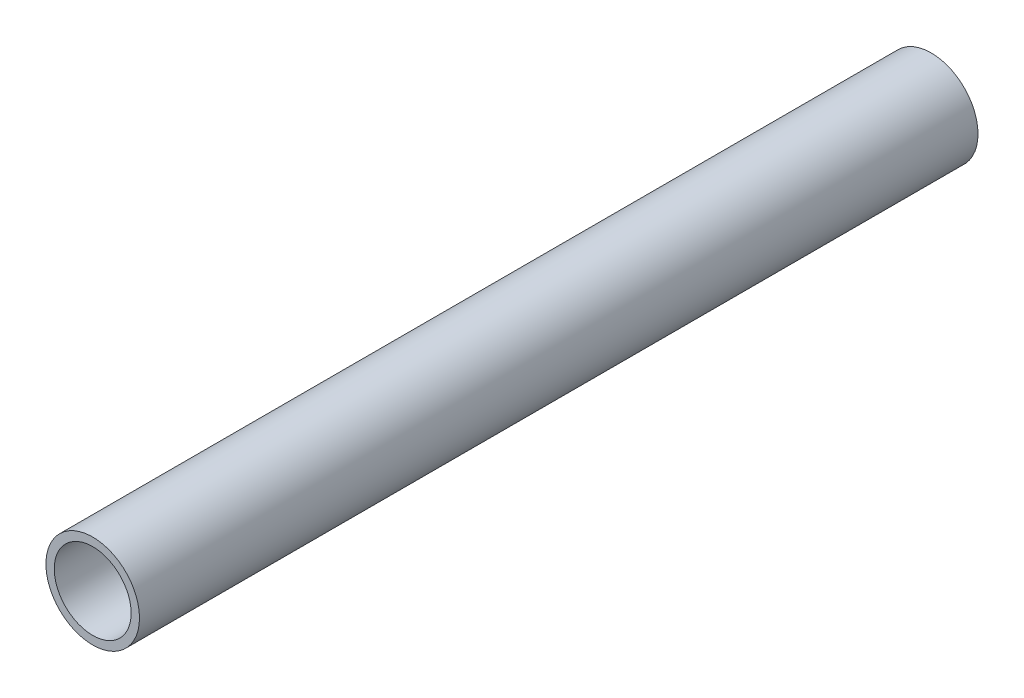
ISO-10303-21;
HEADER;
FILE_DESCRIPTION(('STEP AP214'),'2;1');
FILE_NAME('part.step','',(''),(''),'','','');
FILE_SCHEMA(('AUTOMOTIVE_DESIGN { 1 0 10303 214 1 1 1 1 }'));
ENDSEC;
DATA;
#1=APPLICATION_CONTEXT('core data for automotive mechanical design processes');
#2=APPLICATION_PROTOCOL_DEFINITION('international standard','automotive_design',2000,#1);
#3=PRODUCT_CONTEXT('',#1,'mechanical');
#4=PRODUCT('Part','Part','',(#3));
#5=PRODUCT_RELATED_PRODUCT_CATEGORY('part','',(#4));
#6=PRODUCT_DEFINITION_FORMATION('','',#4);
#7=PRODUCT_DEFINITION_CONTEXT('part definition',#1,'design');
#8=PRODUCT_DEFINITION('design','',#6,#7);
#9=PRODUCT_DEFINITION_SHAPE('','',#8);
#10=(LENGTH_UNIT() NAMED_UNIT(*) SI_UNIT(.MILLI.,.METRE.));
#11=(NAMED_UNIT(*) PLANE_ANGLE_UNIT() SI_UNIT($,.RADIAN.));
#12=(NAMED_UNIT(*) SI_UNIT($,.STERADIAN.) SOLID_ANGLE_UNIT());
#13=UNCERTAINTY_MEASURE_WITH_UNIT(LENGTH_MEASURE(1.E-05),#10,'distance_accuracy_value','');
#14=(GEOMETRIC_REPRESENTATION_CONTEXT(3) GLOBAL_UNCERTAINTY_ASSIGNED_CONTEXT((#13)) GLOBAL_UNIT_ASSIGNED_CONTEXT((#10,
#11,#12)) REPRESENTATION_CONTEXT('',''));
#15=CARTESIAN_POINT('',(0.,0.,0.));
#16=DIRECTION('',(0.,0.,1.));
#17=DIRECTION('',(1.,0.,0.));
#18=AXIS2_PLACEMENT_3D('',#15,#16,#17);
#19=CARTESIAN_POINT('',(0.,0.,151.));
#20=DIRECTION('',(0.,0.,1.));
#21=DIRECTION('',(1.,0.,0.));
#22=AXIS2_PLACEMENT_3D('',#19,#20,#21);
#23=PLANE('',#22);
#24=CARTESIAN_POINT('',(0.,0.,151.));
#25=DIRECTION('',(0.,0.,1.));
#26=DIRECTION('',(1.,0.,0.));
#27=AXIS2_PLACEMENT_3D('',#24,#25,#26);
#28=CIRCLE('',#27,16.85);
#29=CARTESIAN_POINT('',(16.85,0.,151.));
#30=VERTEX_POINT('',#29);
#31=EDGE_CURVE('E10',#30,#30,#28,.T.);
#32=ORIENTED_EDGE('',*,*,#31,.T.);
#33=EDGE_LOOP('',(#32));
#34=FACE_BOUND('',#33,.T.);
#35=CARTESIAN_POINT('',(0.,0.,151.));
#36=DIRECTION('',(0.,0.,1.));
#37=DIRECTION('',(1.,0.,0.));
#38=AXIS2_PLACEMENT_3D('',#35,#36,#37);
#39=CIRCLE('',#38,13.85);
#40=CARTESIAN_POINT('',(13.85,0.,151.));
#41=VERTEX_POINT('',#40);
#42=EDGE_CURVE('E52',#41,#41,#39,.T.);
#43=ORIENTED_EDGE('',*,*,#42,.F.);
#44=EDGE_LOOP('',(#43));
#45=FACE_BOUND('',#44,.T.);
#46=ADVANCED_FACE('F41',(#34,#45),#23,.T.);
#47=CARTESIAN_POINT('',(0.,0.,-151.));
#48=DIRECTION('',(0.,0.,1.));
#49=DIRECTION('',(1.,0.,0.));
#50=AXIS2_PLACEMENT_3D('',#47,#48,#49);
#51=PLANE('',#50);
#52=CARTESIAN_POINT('',(0.,0.,-151.));
#53=DIRECTION('',(0.,0.,1.));
#54=DIRECTION('',(1.,0.,0.));
#55=AXIS2_PLACEMENT_3D('',#52,#53,#54);
#56=CIRCLE('',#55,16.85);
#57=CARTESIAN_POINT('',(16.85,0.,-151.));
#58=VERTEX_POINT('',#57);
#59=EDGE_CURVE('E45',#58,#58,#56,.T.);
#60=ORIENTED_EDGE('',*,*,#59,.F.);
#61=EDGE_LOOP('',(#60));
#62=FACE_BOUND('',#61,.T.);
#63=CARTESIAN_POINT('',(0.,0.,-151.));
#64=DIRECTION('',(0.,0.,1.));
#65=DIRECTION('',(1.,0.,0.));
#66=AXIS2_PLACEMENT_3D('',#63,#64,#65);
#67=CIRCLE('',#66,13.85);
#68=CARTESIAN_POINT('',(13.85,0.,-151.));
#69=VERTEX_POINT('',#68);
#70=EDGE_CURVE('E54',#69,#69,#67,.T.);
#71=ORIENTED_EDGE('',*,*,#70,.T.);
#72=EDGE_LOOP('',(#71));
#73=FACE_BOUND('',#72,.T.);
#74=ADVANCED_FACE('F64',(#62,#73),#51,.F.);
#75=CARTESIAN_POINT('',(0.,0.,151.));
#76=DIRECTION('',(0.,0.,-1.));
#77=DIRECTION('',(-1.,0.,0.));
#78=AXIS2_PLACEMENT_3D('',#75,#76,#77);
#79=CYLINDRICAL_SURFACE('',#78,16.85);
#80=ORIENTED_EDGE('',*,*,#31,.F.);
#81=EDGE_LOOP('',(#80));
#82=FACE_BOUND('',#81,.T.);
#83=ORIENTED_EDGE('',*,*,#59,.T.);
#84=EDGE_LOOP('',(#83));
#85=FACE_BOUND('',#84,.T.);
#86=ADVANCED_FACE('F43',(#82,#85),#79,.T.);
#87=CARTESIAN_POINT('',(0.,0.,151.));
#88=DIRECTION('',(0.,0.,-1.));
#89=DIRECTION('',(-1.,0.,0.));
#90=AXIS2_PLACEMENT_3D('',#87,#88,#89);
#91=CYLINDRICAL_SURFACE('',#90,13.85);
#92=ORIENTED_EDGE('',*,*,#42,.T.);
#93=EDGE_LOOP('',(#92));
#94=FACE_BOUND('',#93,.T.);
#95=ORIENTED_EDGE('',*,*,#70,.F.);
#96=EDGE_LOOP('',(#95));
#97=FACE_BOUND('',#96,.T.);
#98=ADVANCED_FACE('F60',(#94,#97),#91,.F.);
#99=CLOSED_SHELL('',(#46,#74,#86,#98));
#100=MANIFOLD_SOLID_BREP('B2',#99);
#101=ADVANCED_BREP_SHAPE_REPRESENTATION('',(#18,#100),#14);
#102=SHAPE_DEFINITION_REPRESENTATION(#9,#101);
ENDSEC;
END-ISO-10303-21;
